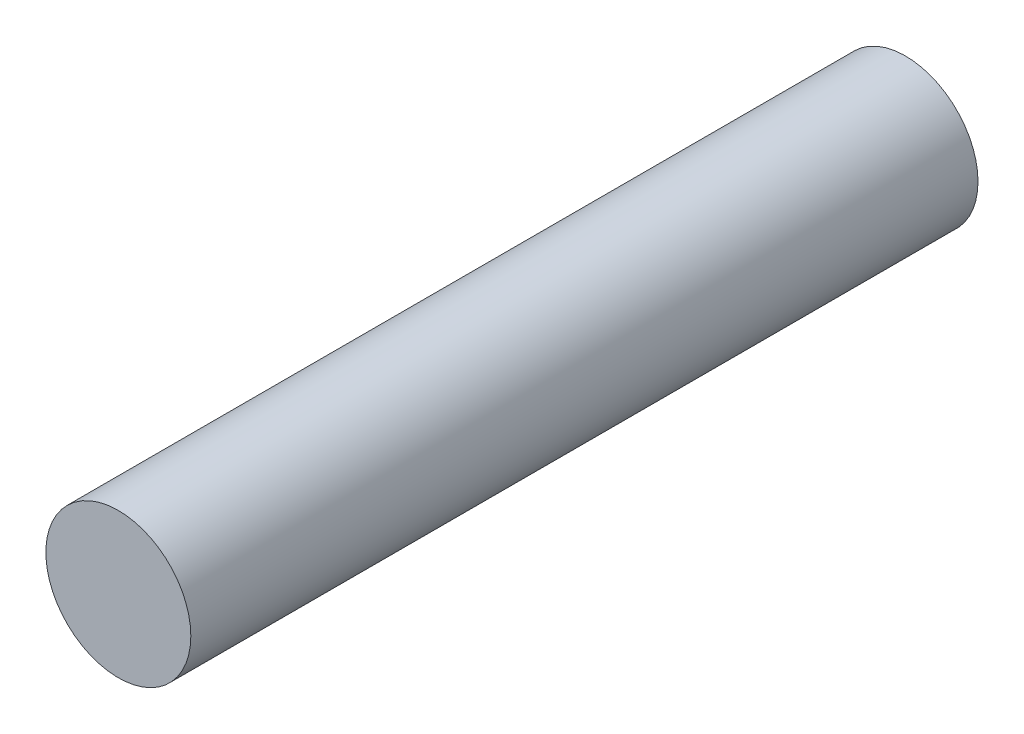
ISO-10303-21;
HEADER;
FILE_DESCRIPTION(('STEP AP214'),'2;1');
FILE_NAME('part.step','',(''),(''),'','','');
FILE_SCHEMA(('AUTOMOTIVE_DESIGN { 1 0 10303 214 1 1 1 1 }'));
ENDSEC;
DATA;
#1=APPLICATION_CONTEXT('core data for automotive mechanical design processes');
#2=APPLICATION_PROTOCOL_DEFINITION('international standard','automotive_design',2000,#1);
#3=PRODUCT_CONTEXT('',#1,'mechanical');
#4=PRODUCT('Part','Part','',(#3));
#5=PRODUCT_RELATED_PRODUCT_CATEGORY('part','',(#4));
#6=PRODUCT_DEFINITION_FORMATION('','',#4);
#7=PRODUCT_DEFINITION_CONTEXT('part definition',#1,'design');
#8=PRODUCT_DEFINITION('design','',#6,#7);
#9=PRODUCT_DEFINITION_SHAPE('','',#8);
#10=(LENGTH_UNIT() NAMED_UNIT(*) SI_UNIT(.MILLI.,.METRE.));
#11=(NAMED_UNIT(*) PLANE_ANGLE_UNIT() SI_UNIT($,.RADIAN.));
#12=(NAMED_UNIT(*) SI_UNIT($,.STERADIAN.) SOLID_ANGLE_UNIT());
#13=UNCERTAINTY_MEASURE_WITH_UNIT(LENGTH_MEASURE(1.E-05),#10,'distance_accuracy_value','');
#14=(GEOMETRIC_REPRESENTATION_CONTEXT(3) GLOBAL_UNCERTAINTY_ASSIGNED_CONTEXT((#13)) GLOBAL_UNIT_ASSIGNED_CONTEXT((#10,
#11,#12)) REPRESENTATION_CONTEXT('',''));
#15=CARTESIAN_POINT('',(0.,0.,0.));
#16=DIRECTION('',(0.,0.,1.));
#17=DIRECTION('',(1.,0.,0.));
#18=AXIS2_PLACEMENT_3D('',#15,#16,#17);
#19=CARTESIAN_POINT('',(0.,0.,137.922));
#20=DIRECTION('',(0.,0.,-1.));
#21=DIRECTION('',(-1.,0.,0.));
#22=AXIS2_PLACEMENT_3D('',#19,#20,#21);
#23=CYLINDRICAL_SURFACE('',#22,12.7);
#24=CARTESIAN_POINT('',(0.,0.,137.922));
#25=DIRECTION('',(0.,0.,1.));
#26=DIRECTION('',(1.,0.,0.));
#27=AXIS2_PLACEMENT_3D('',#24,#25,#26);
#28=CIRCLE('',#27,12.7);
#29=CARTESIAN_POINT('',(12.7,0.,137.922));
#30=VERTEX_POINT('',#29);
#31=EDGE_CURVE('E10',#30,#30,#28,.T.);
#32=ORIENTED_EDGE('',*,*,#31,.F.);
#33=EDGE_LOOP('',(#32));
#34=FACE_BOUND('',#33,.T.);
#35=CARTESIAN_POINT('',(0.,0.,0.));
#36=DIRECTION('',(0.,0.,1.));
#37=DIRECTION('',(1.,0.,0.));
#38=AXIS2_PLACEMENT_3D('',#35,#36,#37);
#39=CIRCLE('',#38,12.7);
#40=CARTESIAN_POINT('',(12.7,0.,0.));
#41=VERTEX_POINT('',#40);
#42=EDGE_CURVE('E34',#41,#41,#39,.T.);
#43=ORIENTED_EDGE('',*,*,#42,.T.);
#44=EDGE_LOOP('',(#43));
#45=FACE_BOUND('',#44,.T.);
#46=ADVANCED_FACE('F31',(#34,#45),#23,.T.);
#47=CARTESIAN_POINT('',(0.,0.,137.922));
#48=DIRECTION('',(0.,0.,1.));
#49=DIRECTION('',(1.,0.,0.));
#50=AXIS2_PLACEMENT_3D('',#47,#48,#49);
#51=PLANE('',#50);
#52=ORIENTED_EDGE('',*,*,#31,.T.);
#53=EDGE_LOOP('',(#52));
#54=FACE_BOUND('',#53,.T.);
#55=ADVANCED_FACE('F46',(#54),#51,.T.);
#56=CARTESIAN_POINT('',(0.,0.,0.));
#57=DIRECTION('',(0.,0.,1.));
#58=DIRECTION('',(1.,0.,0.));
#59=AXIS2_PLACEMENT_3D('',#56,#57,#58);
#60=PLANE('',#59);
#61=ORIENTED_EDGE('',*,*,#42,.F.);
#62=EDGE_LOOP('',(#61));
#63=FACE_BOUND('',#62,.T.);
#64=ADVANCED_FACE('F44',(#63),#60,.F.);
#65=CLOSED_SHELL('',(#46,#55,#64));
#66=MANIFOLD_SOLID_BREP('B2',#65);
#67=ADVANCED_BREP_SHAPE_REPRESENTATION('',(#18,#66),#14);
#68=SHAPE_DEFINITION_REPRESENTATION(#9,#67);
ENDSEC;
END-ISO-10303-21;
